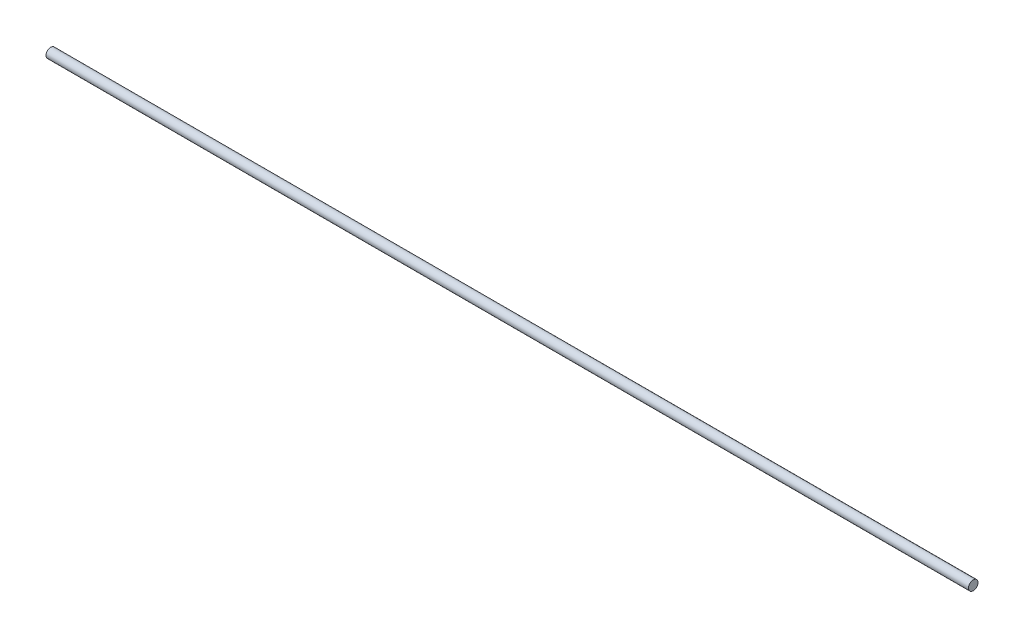
ISO-10303-21;
HEADER;
FILE_DESCRIPTION(('STEP AP214'),'2;1');
FILE_NAME('part.step','',(''),(''),'','','');
FILE_SCHEMA(('AUTOMOTIVE_DESIGN { 1 0 10303 214 1 1 1 1 }'));
ENDSEC;
DATA;
#1=APPLICATION_CONTEXT('core data for automotive mechanical design processes');
#2=APPLICATION_PROTOCOL_DEFINITION('international standard','automotive_design',2000,#1);
#3=PRODUCT_CONTEXT('',#1,'mechanical');
#4=PRODUCT('Part','Part','',(#3));
#5=PRODUCT_RELATED_PRODUCT_CATEGORY('part','',(#4));
#6=PRODUCT_DEFINITION_FORMATION('','',#4);
#7=PRODUCT_DEFINITION_CONTEXT('part definition',#1,'design');
#8=PRODUCT_DEFINITION('design','',#6,#7);
#9=PRODUCT_DEFINITION_SHAPE('','',#8);
#10=(LENGTH_UNIT() NAMED_UNIT(*) SI_UNIT(.MILLI.,.METRE.));
#11=(NAMED_UNIT(*) PLANE_ANGLE_UNIT() SI_UNIT($,.RADIAN.));
#12=(NAMED_UNIT(*) SI_UNIT($,.STERADIAN.) SOLID_ANGLE_UNIT());
#13=UNCERTAINTY_MEASURE_WITH_UNIT(LENGTH_MEASURE(1.E-05),#10,'distance_accuracy_value','');
#14=(GEOMETRIC_REPRESENTATION_CONTEXT(3) GLOBAL_UNCERTAINTY_ASSIGNED_CONTEXT((#13)) GLOBAL_UNIT_ASSIGNED_CONTEXT((#10,
#11,#12)) REPRESENTATION_CONTEXT('',''));
#15=CARTESIAN_POINT('',(0.,0.,0.));
#16=DIRECTION('',(0.,0.,1.));
#17=DIRECTION('',(1.,0.,0.));
#18=AXIS2_PLACEMENT_3D('',#15,#16,#17);
#19=CARTESIAN_POINT('',(306.5,0.,0.));
#20=DIRECTION('',(-1.,0.,0.));
#21=DIRECTION('',(0.,0.,1.));
#22=AXIS2_PLACEMENT_3D('',#19,#20,#21);
#23=CYLINDRICAL_SURFACE('',#22,3.15);
#24=CARTESIAN_POINT('',(306.5,0.,0.));
#25=DIRECTION('',(1.,0.,0.));
#26=DIRECTION('',(0.,0.,-1.));
#27=AXIS2_PLACEMENT_3D('',#24,#25,#26);
#28=CIRCLE('',#27,3.15);
#29=CARTESIAN_POINT('',(306.5,0.,-3.15));
#30=VERTEX_POINT('',#29);
#31=EDGE_CURVE('E10',#30,#30,#28,.T.);
#32=ORIENTED_EDGE('',*,*,#31,.F.);
#33=EDGE_LOOP('',(#32));
#34=FACE_BOUND('',#33,.T.);
#35=CARTESIAN_POINT('',(-306.5,0.,0.));
#36=DIRECTION('',(1.,0.,0.));
#37=DIRECTION('',(0.,0.,-1.));
#38=AXIS2_PLACEMENT_3D('',#35,#36,#37);
#39=CIRCLE('',#38,3.15);
#40=CARTESIAN_POINT('',(-306.5,0.,-3.15));
#41=VERTEX_POINT('',#40);
#42=EDGE_CURVE('E42',#41,#41,#39,.T.);
#43=ORIENTED_EDGE('',*,*,#42,.T.);
#44=EDGE_LOOP('',(#43));
#45=FACE_BOUND('',#44,.T.);
#46=ADVANCED_FACE('F39',(#34,#45),#23,.T.);
#47=CARTESIAN_POINT('',(306.5,0.,0.));
#48=DIRECTION('',(1.,0.,0.));
#49=DIRECTION('',(0.,0.,-1.));
#50=AXIS2_PLACEMENT_3D('',#47,#48,#49);
#51=PLANE('',#50);
#52=ORIENTED_EDGE('',*,*,#31,.T.);
#53=EDGE_LOOP('',(#52));
#54=FACE_BOUND('',#53,.T.);
#55=ADVANCED_FACE('F56',(#54),#51,.T.);
#56=CARTESIAN_POINT('',(-306.5,0.,0.));
#57=DIRECTION('',(1.,0.,0.));
#58=DIRECTION('',(0.,0.,-1.));
#59=AXIS2_PLACEMENT_3D('',#56,#57,#58);
#60=PLANE('',#59);
#61=ORIENTED_EDGE('',*,*,#42,.F.);
#62=EDGE_LOOP('',(#61));
#63=FACE_BOUND('',#62,.T.);
#64=ADVANCED_FACE('F54',(#63),#60,.F.);
#65=CLOSED_SHELL('',(#46,#55,#64));
#66=MANIFOLD_SOLID_BREP('B2',#65);
#67=ADVANCED_BREP_SHAPE_REPRESENTATION('',(#18,#66),#14);
#68=SHAPE_DEFINITION_REPRESENTATION(#9,#67);
ENDSEC;
END-ISO-10303-21;
